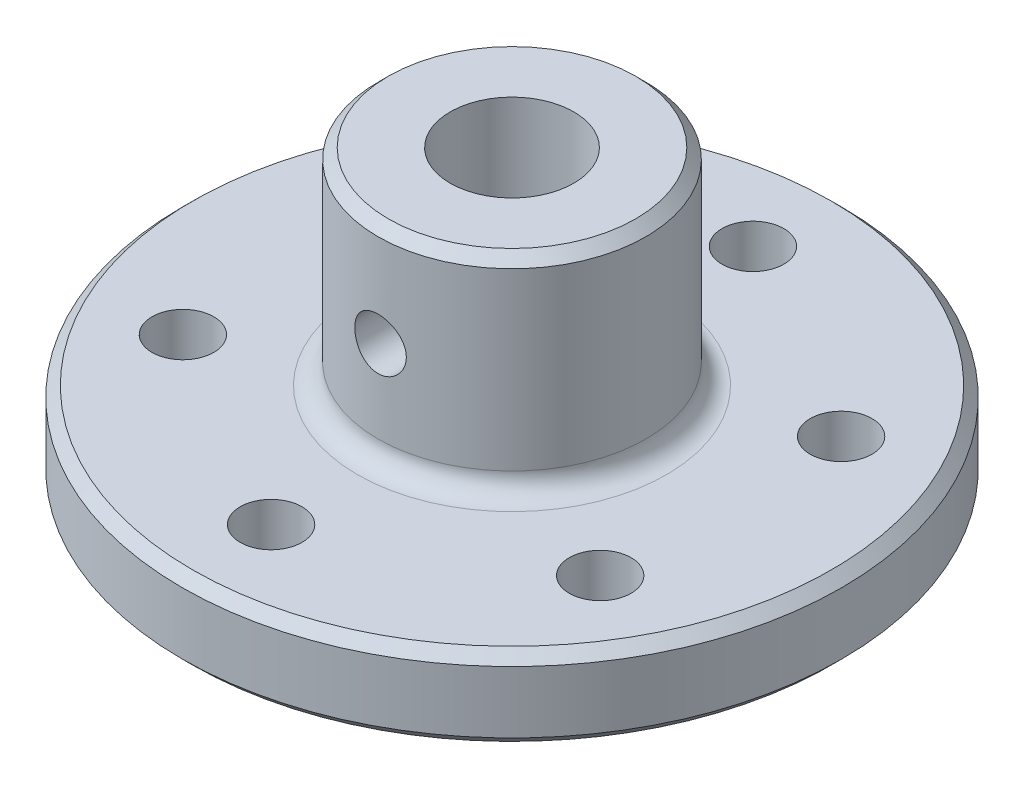
ISO-10303-21;
HEADER;
FILE_DESCRIPTION(('STEP AP214'),'2;1');
FILE_NAME('part.step','',(''),(''),'','','');
FILE_SCHEMA(('AUTOMOTIVE_DESIGN { 1 0 10303 214 1 1 1 1 }'));
ENDSEC;
DATA;
#1=APPLICATION_CONTEXT('core data for automotive mechanical design processes');
#2=APPLICATION_PROTOCOL_DEFINITION('international standard','automotive_design',2000,#1);
#3=PRODUCT_CONTEXT('',#1,'mechanical');
#4=PRODUCT('Part','Part','',(#3));
#5=PRODUCT_RELATED_PRODUCT_CATEGORY('part','',(#4));
#6=PRODUCT_DEFINITION_FORMATION('','',#4);
#7=PRODUCT_DEFINITION_CONTEXT('part definition',#1,'design');
#8=PRODUCT_DEFINITION('design','',#6,#7);
#9=PRODUCT_DEFINITION_SHAPE('','',#8);
#10=(LENGTH_UNIT() NAMED_UNIT(*) SI_UNIT(.MILLI.,.METRE.));
#11=(NAMED_UNIT(*) PLANE_ANGLE_UNIT() SI_UNIT($,.RADIAN.));
#12=(NAMED_UNIT(*) SI_UNIT($,.STERADIAN.) SOLID_ANGLE_UNIT());
#13=UNCERTAINTY_MEASURE_WITH_UNIT(LENGTH_MEASURE(1.E-05),#10,'distance_accuracy_value','');
#14=(GEOMETRIC_REPRESENTATION_CONTEXT(3) GLOBAL_UNCERTAINTY_ASSIGNED_CONTEXT((#13)) GLOBAL_UNIT_ASSIGNED_CONTEXT((#10,
#11,#12)) REPRESENTATION_CONTEXT('',''));
#15=CARTESIAN_POINT('',(0.,0.,0.));
#16=DIRECTION('',(0.,0.,1.));
#17=DIRECTION('',(1.,0.,0.));
#18=AXIS2_PLACEMENT_3D('',#15,#16,#17);
#19=CARTESIAN_POINT('',(0.,4.,0.));
#20=DIRECTION('',(0.,1.,0.));
#21=DIRECTION('',(0.,0.,1.));
#22=AXIS2_PLACEMENT_3D('',#19,#20,#21);
#23=PLANE('',#22);
#24=CARTESIAN_POINT('',(0.,4.,0.));
#25=DIRECTION('',(0.,1.,0.));
#26=DIRECTION('',(0.,0.,1.));
#27=AXIS2_PLACEMENT_3D('',#24,#25,#26);
#28=CIRCLE('',#27,15.5);
#29=CARTESIAN_POINT('',(0.,4.,15.5));
#30=VERTEX_POINT('',#29);
#31=EDGE_CURVE('E44',#30,#30,#28,.T.);
#32=ORIENTED_EDGE('',*,*,#31,.T.);
#33=EDGE_LOOP('',(#32));
#34=FACE_BOUND('',#33,.T.);
#35=CARTESIAN_POINT('',(0.,4.,0.));
#36=DIRECTION('',(0.,1.,0.));
#37=DIRECTION('',(0.,0.,1.));
#38=AXIS2_PLACEMENT_3D('',#35,#36,#37);
#39=CIRCLE('',#38,7.5);
#40=CARTESIAN_POINT('',(0.,4.,7.5));
#41=VERTEX_POINT('',#40);
#42=EDGE_CURVE('E59',#41,#41,#39,.F.);
#43=ORIENTED_EDGE('',*,*,#42,.T.);
#44=EDGE_LOOP('',(#43));
#45=FACE_BOUND('',#44,.T.);
#46=CARTESIAN_POINT('',(-10.125,4.,5.84567147554497));
#47=DIRECTION('',(0.,1.,0.));
#48=DIRECTION('',(0.,0.,1.));
#49=AXIS2_PLACEMENT_3D('',#46,#47,#48);
#50=CIRCLE('',#49,1.5);
#51=CARTESIAN_POINT('',(-10.125,4.,7.34567147554497));
#52=VERTEX_POINT('',#51);
#53=EDGE_CURVE('E169',#52,#52,#50,.T.);
#54=ORIENTED_EDGE('',*,*,#53,.F.);
#55=EDGE_LOOP('',(#54));
#56=FACE_BOUND('',#55,.T.);
#57=CARTESIAN_POINT('',(10.125,4.,5.84567147554496));
#58=DIRECTION('',(0.,1.,0.));
#59=DIRECTION('',(0.,0.,1.));
#60=AXIS2_PLACEMENT_3D('',#57,#58,#59);
#61=CIRCLE('',#60,1.49999999999997);
#62=CARTESIAN_POINT('',(10.125,4.,7.34567147554494));
#63=VERTEX_POINT('',#62);
#64=EDGE_CURVE('E173',#63,#63,#61,.T.);
#65=ORIENTED_EDGE('',*,*,#64,.F.);
#66=EDGE_LOOP('',(#65));
#67=FACE_BOUND('',#66,.T.);
#68=CARTESIAN_POINT('',(0.,4.,-11.6913429510899));
#69=DIRECTION('',(0.,1.,0.));
#70=DIRECTION('',(0.,0.,1.));
#71=AXIS2_PLACEMENT_3D('',#68,#69,#70);
#72=CIRCLE('',#71,1.5);
#73=CARTESIAN_POINT('',(0.,4.,-10.1913429510899));
#74=VERTEX_POINT('',#73);
#75=EDGE_CURVE('E177',#74,#74,#72,.T.);
#76=ORIENTED_EDGE('',*,*,#75,.F.);
#77=EDGE_LOOP('',(#76));
#78=FACE_BOUND('',#77,.T.);
#79=CARTESIAN_POINT('',(10.125,4.,-5.84567147554497));
#80=DIRECTION('',(0.,1.,0.));
#81=DIRECTION('',(0.,0.,1.));
#82=AXIS2_PLACEMENT_3D('',#79,#80,#81);
#83=CIRCLE('',#82,1.5);
#84=CARTESIAN_POINT('',(10.125,4.,-4.34567147554497));
#85=VERTEX_POINT('',#84);
#86=EDGE_CURVE('E181',#85,#85,#83,.T.);
#87=ORIENTED_EDGE('',*,*,#86,.F.);
#88=EDGE_LOOP('',(#87));
#89=FACE_BOUND('',#88,.T.);
#90=CARTESIAN_POINT('',(0.,4.,11.6913429510899));
#91=DIRECTION('',(0.,1.,0.));
#92=DIRECTION('',(0.,0.,1.));
#93=AXIS2_PLACEMENT_3D('',#90,#91,#92);
#94=CIRCLE('',#93,1.5);
#95=CARTESIAN_POINT('',(0.,4.,13.1913429510899));
#96=VERTEX_POINT('',#95);
#97=EDGE_CURVE('E185',#96,#96,#94,.T.);
#98=ORIENTED_EDGE('',*,*,#97,.F.);
#99=EDGE_LOOP('',(#98));
#100=FACE_BOUND('',#99,.T.);
#101=CARTESIAN_POINT('',(-10.125,4.,-5.84567147554496));
#102=DIRECTION('',(0.,1.,0.));
#103=DIRECTION('',(0.,0.,1.));
#104=AXIS2_PLACEMENT_3D('',#101,#102,#103);
#105=CIRCLE('',#104,1.5);
#106=CARTESIAN_POINT('',(-10.125,4.,-4.34567147554496));
#107=VERTEX_POINT('',#106);
#108=EDGE_CURVE('E188',#107,#107,#105,.T.);
#109=ORIENTED_EDGE('',*,*,#108,.F.);
#110=EDGE_LOOP('',(#109));
#111=FACE_BOUND('',#110,.T.);
#112=ADVANCED_FACE('F32',(#34,#45,#56,#67,#78,#89,#100,#111),#23,.T.);
#113=CARTESIAN_POINT('',(0.,0.,0.));
#114=DIRECTION('',(0.,1.,0.));
#115=DIRECTION('',(0.,0.,1.));
#116=AXIS2_PLACEMENT_3D('',#113,#114,#115);
#117=PLANE('',#116);
#118=CARTESIAN_POINT('',(0.,0.,0.));
#119=DIRECTION('',(0.,1.,0.));
#120=DIRECTION('',(0.,0.,1.));
#121=AXIS2_PLACEMENT_3D('',#118,#119,#120);
#122=CIRCLE('',#121,15.5);
#123=CARTESIAN_POINT('',(0.,0.,15.5));
#124=VERTEX_POINT('',#123);
#125=EDGE_CURVE('E48',#124,#124,#122,.F.);
#126=ORIENTED_EDGE('',*,*,#125,.T.);
#127=EDGE_LOOP('',(#126));
#128=FACE_BOUND('',#127,.T.);
#129=CARTESIAN_POINT('',(0.,0.,-11.6913429510899));
#130=DIRECTION('',(0.,1.,0.));
#131=DIRECTION('',(0.,0.,1.));
#132=AXIS2_PLACEMENT_3D('',#129,#130,#131);
#133=CIRCLE('',#132,1.5);
#134=CARTESIAN_POINT('',(0.,0.,-10.1913429510899));
#135=VERTEX_POINT('',#134);
#136=EDGE_CURVE('E210',#135,#135,#133,.T.);
#137=ORIENTED_EDGE('',*,*,#136,.T.);
#138=EDGE_LOOP('',(#137));
#139=FACE_BOUND('',#138,.T.);
#140=CARTESIAN_POINT('',(10.125,0.,-5.84567147554497));
#141=DIRECTION('',(0.,1.,0.));
#142=DIRECTION('',(0.,0.,1.));
#143=AXIS2_PLACEMENT_3D('',#140,#141,#142);
#144=CIRCLE('',#143,1.5);
#145=CARTESIAN_POINT('',(10.125,0.,-4.34567147554497));
#146=VERTEX_POINT('',#145);
#147=EDGE_CURVE('E206',#146,#146,#144,.T.);
#148=ORIENTED_EDGE('',*,*,#147,.T.);
#149=EDGE_LOOP('',(#148));
#150=FACE_BOUND('',#149,.T.);
#151=CARTESIAN_POINT('',(10.125,0.,5.84567147554496));
#152=DIRECTION('',(0.,1.,0.));
#153=DIRECTION('',(0.,0.,1.));
#154=AXIS2_PLACEMENT_3D('',#151,#152,#153);
#155=CIRCLE('',#154,1.49999999999997);
#156=CARTESIAN_POINT('',(10.125,0.,7.34567147554494));
#157=VERTEX_POINT('',#156);
#158=EDGE_CURVE('E202',#157,#157,#155,.T.);
#159=ORIENTED_EDGE('',*,*,#158,.T.);
#160=EDGE_LOOP('',(#159));
#161=FACE_BOUND('',#160,.T.);
#162=CARTESIAN_POINT('',(0.,0.,11.6913429510899));
#163=DIRECTION('',(0.,1.,0.));
#164=DIRECTION('',(0.,0.,1.));
#165=AXIS2_PLACEMENT_3D('',#162,#163,#164);
#166=CIRCLE('',#165,1.5);
#167=CARTESIAN_POINT('',(0.,0.,13.1913429510899));
#168=VERTEX_POINT('',#167);
#169=EDGE_CURVE('E199',#168,#168,#166,.T.);
#170=ORIENTED_EDGE('',*,*,#169,.T.);
#171=EDGE_LOOP('',(#170));
#172=FACE_BOUND('',#171,.T.);
#173=CARTESIAN_POINT('',(-10.125,0.,5.84567147554497));
#174=DIRECTION('',(0.,1.,0.));
#175=DIRECTION('',(0.,0.,1.));
#176=AXIS2_PLACEMENT_3D('',#173,#174,#175);
#177=CIRCLE('',#176,1.5);
#178=CARTESIAN_POINT('',(-10.125,0.,7.34567147554497));
#179=VERTEX_POINT('',#178);
#180=EDGE_CURVE('E189',#179,#179,#177,.T.);
#181=ORIENTED_EDGE('',*,*,#180,.T.);
#182=EDGE_LOOP('',(#181));
#183=FACE_BOUND('',#182,.T.);
#184=CARTESIAN_POINT('',(-10.125,0.,-5.84567147554496));
#185=DIRECTION('',(0.,1.,0.));
#186=DIRECTION('',(0.,0.,1.));
#187=AXIS2_PLACEMENT_3D('',#184,#185,#186);
#188=CIRCLE('',#187,1.5);
#189=CARTESIAN_POINT('',(-10.125,0.,-4.34567147554496));
#190=VERTEX_POINT('',#189);
#191=EDGE_CURVE('E190',#190,#190,#188,.T.);
#192=ORIENTED_EDGE('',*,*,#191,.T.);
#193=EDGE_LOOP('',(#192));
#194=FACE_BOUND('',#193,.T.);
#195=CARTESIAN_POINT('',(0.,0.,0.));
#196=DIRECTION('',(0.,1.,0.));
#197=DIRECTION('',(0.,0.,1.));
#198=AXIS2_PLACEMENT_3D('',#195,#196,#197);
#199=CIRCLE('',#198,3.);
#200=CARTESIAN_POINT('',(0.,0.,3.));
#201=VERTEX_POINT('',#200);
#202=EDGE_CURVE('E195',#201,#201,#199,.T.);
#203=ORIENTED_EDGE('',*,*,#202,.T.);
#204=EDGE_LOOP('',(#203));
#205=FACE_BOUND('',#204,.T.);
#206=ADVANCED_FACE('F132',(#128,#139,#150,#161,#172,#183,#194,#205),#117,.F.);
#207=CARTESIAN_POINT('',(0.,4.,0.));
#208=DIRECTION('',(0.,-1.,0.));
#209=DIRECTION('',(0.,0.,-1.));
#210=AXIS2_PLACEMENT_3D('',#207,#208,#209);
#211=CYLINDRICAL_SURFACE('',#210,16.);
#212=CARTESIAN_POINT('',(0.,0.5,0.));
#213=DIRECTION('',(0.,1.,0.));
#214=DIRECTION('',(0.,0.,1.));
#215=AXIS2_PLACEMENT_3D('',#212,#213,#214);
#216=CIRCLE('',#215,16.);
#217=CARTESIAN_POINT('',(0.,0.5,16.));
#218=VERTEX_POINT('',#217);
#219=EDGE_CURVE('E53',#218,#218,#216,.T.);
#220=ORIENTED_EDGE('',*,*,#219,.T.);
#221=EDGE_LOOP('',(#220));
#222=FACE_BOUND('',#221,.T.);
#223=CARTESIAN_POINT('',(0.,3.5,0.));
#224=DIRECTION('',(0.,1.,0.));
#225=DIRECTION('',(0.,0.,1.));
#226=AXIS2_PLACEMENT_3D('',#223,#224,#225);
#227=CIRCLE('',#226,16.);
#228=CARTESIAN_POINT('',(0.,3.5,16.));
#229=VERTEX_POINT('',#228);
#230=EDGE_CURVE('E56',#229,#229,#227,.F.);
#231=ORIENTED_EDGE('',*,*,#230,.T.);
#232=EDGE_LOOP('',(#231));
#233=FACE_BOUND('',#232,.T.);
#234=ADVANCED_FACE('F128',(#222,#233),#211,.T.);
#235=CARTESIAN_POINT('',(0.,4.,-11.6913429510899));
#236=DIRECTION('',(0.,-1.,0.));
#237=DIRECTION('',(0.,0.,-1.));
#238=AXIS2_PLACEMENT_3D('',#235,#236,#237);
#239=CYLINDRICAL_SURFACE('',#238,1.5);
#240=ORIENTED_EDGE('',*,*,#75,.T.);
#241=EDGE_LOOP('',(#240));
#242=FACE_BOUND('',#241,.T.);
#243=ORIENTED_EDGE('',*,*,#136,.F.);
#244=EDGE_LOOP('',(#243));
#245=FACE_BOUND('',#244,.T.);
#246=ADVANCED_FACE('F124',(#242,#245),#239,.F.);
#247=CARTESIAN_POINT('',(10.125,4.,-5.84567147554497));
#248=DIRECTION('',(0.,-1.,0.));
#249=DIRECTION('',(0.,0.,-1.));
#250=AXIS2_PLACEMENT_3D('',#247,#248,#249);
#251=CYLINDRICAL_SURFACE('',#250,1.5);
#252=ORIENTED_EDGE('',*,*,#86,.T.);
#253=EDGE_LOOP('',(#252));
#254=FACE_BOUND('',#253,.T.);
#255=ORIENTED_EDGE('',*,*,#147,.F.);
#256=EDGE_LOOP('',(#255));
#257=FACE_BOUND('',#256,.T.);
#258=ADVANCED_FACE('F120',(#254,#257),#251,.F.);
#259=CARTESIAN_POINT('',(10.125,4.,5.84567147554496));
#260=DIRECTION('',(0.,-1.,0.));
#261=DIRECTION('',(0.,0.,-1.));
#262=AXIS2_PLACEMENT_3D('',#259,#260,#261);
#263=CYLINDRICAL_SURFACE('',#262,1.49999999999997);
#264=ORIENTED_EDGE('',*,*,#64,.T.);
#265=EDGE_LOOP('',(#264));
#266=FACE_BOUND('',#265,.T.);
#267=ORIENTED_EDGE('',*,*,#158,.F.);
#268=EDGE_LOOP('',(#267));
#269=FACE_BOUND('',#268,.T.);
#270=ADVANCED_FACE('F116',(#266,#269),#263,.F.);
#271=CARTESIAN_POINT('',(0.,4.,11.6913429510899));
#272=DIRECTION('',(0.,-1.,0.));
#273=DIRECTION('',(0.,0.,-1.));
#274=AXIS2_PLACEMENT_3D('',#271,#272,#273);
#275=CYLINDRICAL_SURFACE('',#274,1.5);
#276=ORIENTED_EDGE('',*,*,#97,.T.);
#277=EDGE_LOOP('',(#276));
#278=FACE_BOUND('',#277,.T.);
#279=ORIENTED_EDGE('',*,*,#169,.F.);
#280=EDGE_LOOP('',(#279));
#281=FACE_BOUND('',#280,.T.);
#282=ADVANCED_FACE('F112',(#278,#281),#275,.F.);
#283=CARTESIAN_POINT('',(-10.125,4.,5.84567147554497));
#284=DIRECTION('',(0.,-1.,0.));
#285=DIRECTION('',(0.,0.,-1.));
#286=AXIS2_PLACEMENT_3D('',#283,#284,#285);
#287=CYLINDRICAL_SURFACE('',#286,1.5);
#288=ORIENTED_EDGE('',*,*,#53,.T.);
#289=EDGE_LOOP('',(#288));
#290=FACE_BOUND('',#289,.T.);
#291=ORIENTED_EDGE('',*,*,#180,.F.);
#292=EDGE_LOOP('',(#291));
#293=FACE_BOUND('',#292,.T.);
#294=ADVANCED_FACE('F108',(#290,#293),#287,.F.);
#295=CARTESIAN_POINT('',(-10.125,4.,-5.84567147554496));
#296=DIRECTION('',(0.,-1.,0.));
#297=DIRECTION('',(0.,0.,-1.));
#298=AXIS2_PLACEMENT_3D('',#295,#296,#297);
#299=CYLINDRICAL_SURFACE('',#298,1.5);
#300=ORIENTED_EDGE('',*,*,#108,.T.);
#301=EDGE_LOOP('',(#300));
#302=FACE_BOUND('',#301,.T.);
#303=ORIENTED_EDGE('',*,*,#191,.F.);
#304=EDGE_LOOP('',(#303));
#305=FACE_BOUND('',#304,.T.);
#306=ADVANCED_FACE('F103',(#302,#305),#299,.F.);
#307=CARTESIAN_POINT('',(0.,4.,0.));
#308=DIRECTION('',(0.,-1.,0.));
#309=DIRECTION('',(0.,0.,-1.));
#310=AXIS2_PLACEMENT_3D('',#307,#308,#309);
#311=CYLINDRICAL_SURFACE('',#310,3.);
#312=CARTESIAN_POINT('',(0.,10.25,-3.));
#313=CARTESIAN_POINT('',(-0.066958052636267,10.2499927949087,-2.99999458367273));
#314=CARTESIAN_POINT('',(-0.134021397063841,10.2445880414719,-2.9977323297471));
#315=CARTESIAN_POINT('',(-0.266247371156347,10.2231609350798,-2.98890153579552));
#316=CARTESIAN_POINT('',(-0.331404576423565,10.2071108755358,-2.98232175901028));
#317=CARTESIAN_POINT('',(-0.457688733653088,10.1650889082194,-2.96556289038127));
#318=CARTESIAN_POINT('',(-0.518828524426269,10.1391506105319,-2.95539599975004));
#319=CARTESIAN_POINT('',(-0.635829756679802,10.0782271767674,-2.93245286470664));
#320=CARTESIAN_POINT('',(-0.691692790015939,10.0432447810291,-2.91967741092849));
#321=CARTESIAN_POINT('',(-0.799448403559512,9.96337101740912,-2.89207828351869));
#322=CARTESIAN_POINT('',(-0.851041267517768,9.91809869121025,-2.87718753326093));
#323=CARTESIAN_POINT('',(-0.946159821091262,9.81973566521743,-2.84732714068514));
#324=CARTESIAN_POINT('',(-0.989681263153085,9.7666408751055,-2.83235746106809));
#325=CARTESIAN_POINT('',(-1.06953737697066,9.65097322243511,-2.80321021812995));
#326=CARTESIAN_POINT('',(-1.10541308153925,9.58806255157346,-2.78910786873385));
#327=CARTESIAN_POINT('',(-1.16593940588866,9.45642674207907,-2.76435572357005));
#328=CARTESIAN_POINT('',(-1.19059580836291,9.38770462051555,-2.75370415000823));
#329=CARTESIAN_POINT('',(-1.22674598312159,9.24984630823208,-2.73778555387705));
#330=CARTESIAN_POINT('',(-1.23881657877606,9.18088951660785,-2.73228387651787));
#331=CARTESIAN_POINT('',(-1.25125209967796,9.04172670731343,-2.72661326219504));
#332=CARTESIAN_POINT('',(-1.25162348054397,8.97152139997426,-2.7264413842526));
#333=CARTESIAN_POINT('',(-1.24108450363674,8.83759993956506,-2.73125119560853));
#334=CARTESIAN_POINT('',(-1.23103681112301,8.77379890343554,-2.73583882723623));
#335=CARTESIAN_POINT('',(-1.20139191015777,8.64888790899961,-2.74898482773796));
#336=CARTESIAN_POINT('',(-1.18179287287177,8.58777846850823,-2.75754395703564));
#337=CARTESIAN_POINT('',(-1.13321958727571,8.46844229700856,-2.77786184772756));
#338=CARTESIAN_POINT('',(-1.10405471539236,8.41030457908662,-2.78968481949136));
#339=CARTESIAN_POINT('',(-1.03731242580562,8.29952226611985,-2.81518331141086));
#340=CARTESIAN_POINT('',(-0.999731690519545,8.24687984938648,-2.82885956129779));
#341=CARTESIAN_POINT('',(-0.913495965543835,8.14390004126716,-2.85792976877979));
#342=CARTESIAN_POINT('',(-0.864173483207526,8.09413343261456,-2.87337121404473));
#343=CARTESIAN_POINT('',(-0.757729591051512,8.00338649704082,-2.90325673112529));
#344=CARTESIAN_POINT('',(-0.700606359448457,7.96240822830782,-2.9177005687701));
#345=CARTESIAN_POINT('',(-0.578447948693377,7.88956417638373,-2.94438283556473));
#346=CARTESIAN_POINT('',(-0.513260582447681,7.85793055484932,-2.95656266543334));
#347=CARTESIAN_POINT('',(-0.377852402526833,7.80627886039674,-2.97689481414803));
#348=CARTESIAN_POINT('',(-0.307634394795036,7.78625436805619,-2.985049358458));
#349=CARTESIAN_POINT('',(-0.168928113346229,7.75958400787336,-2.99599641186385));
#350=CARTESIAN_POINT('',(-0.10061128527864,7.75217214255625,-2.99909541047125));
#351=CARTESIAN_POINT('',(0.036354655496088,7.74865377638591,-3.00056050368745));
#352=CARTESIAN_POINT('',(0.105003667152635,7.752544029748,-2.99892795711939));
#353=CARTESIAN_POINT('',(0.237098242341434,7.77097108480607,-2.9913121765694));
#354=CARTESIAN_POINT('',(0.300632966639385,7.7849699540972,-2.9855488728399));
#355=CARTESIAN_POINT('',(0.42438274897109,7.82246819454078,-2.97048606772414));
#356=CARTESIAN_POINT('',(0.48459738651836,7.8459687659503,-2.96118611959704));
#357=CARTESIAN_POINT('',(0.602108999869136,7.90257097571212,-2.93958270645166));
#358=CARTESIAN_POINT('',(0.659257236855323,7.93594818314603,-2.92719491469281));
#359=CARTESIAN_POINT('',(0.767346216231429,8.0110533777917,-2.9007380457909));
#360=CARTESIAN_POINT('',(0.818284352601941,8.05278485152927,-2.88666826768733));
#361=CARTESIAN_POINT('',(0.916333430274264,8.14690323327241,-2.85712087895438));
#362=CARTESIAN_POINT('',(0.962910697979836,8.19983850298626,-2.84161451591029));
#363=CARTESIAN_POINT('',(1.04666984610551,8.31302127593539,-2.81184336768005));
#364=CARTESIAN_POINT('',(1.08384959285617,8.37327043517173,-2.79757886493438));
#365=CARTESIAN_POINT('',(1.14815960208699,8.50061417530258,-2.77181386243988));
#366=CARTESIAN_POINT('',(1.17513918237329,8.56779403551483,-2.76035562555112));
#367=CARTESIAN_POINT('',(1.21717413951573,8.70637059381011,-2.74208355658957));
#368=CARTESIAN_POINT('',(1.23223934863688,8.77776376248335,-2.73526589555752));
#369=CARTESIAN_POINT('',(1.24904080348901,8.91681869919921,-2.72763164537264));
#370=CARTESIAN_POINT('',(1.25171380413129,8.98434466229262,-2.72639350967163));
#371=CARTESIAN_POINT('',(1.24615575523912,9.1188428611411,-2.72893853011024));
#372=CARTESIAN_POINT('',(1.23792637964722,9.18581518031369,-2.73272091540306));
#373=CARTESIAN_POINT('',(1.21158404780491,9.31409274746889,-2.74449551302268));
#374=CARTESIAN_POINT('',(1.19394903571466,9.37551667346339,-2.7522835484648));
#375=CARTESIAN_POINT('',(1.14976328202135,9.49454802135723,-2.77103181199189));
#376=CARTESIAN_POINT('',(1.12321003517252,9.55215436539878,-2.78199293131693));
#377=CARTESIAN_POINT('',(1.0601028593549,9.66569589594912,-2.80666954560013));
#378=CARTESIAN_POINT('',(1.02304360910483,9.72132233016829,-2.82051102713679));
#379=CARTESIAN_POINT('',(0.940684072630392,9.82586013936068,-2.84903689053839));
#380=CARTESIAN_POINT('',(0.89538092890562,9.87476917560057,-2.86372156345875));
#381=CARTESIAN_POINT('',(0.793902045778822,9.96814868168475,-2.89356392850106));
#382=CARTESIAN_POINT('',(0.737174739949029,10.0120364328407,-2.90867817511792));
#383=CARTESIAN_POINT('',(0.616600079253201,10.0896994535436,-2.9366014362202));
#384=CARTESIAN_POINT('',(0.552749497945748,10.1234701148896,-2.9494093991674));
#385=CARTESIAN_POINT('',(0.420732056717952,10.1792098454399,-2.97109183362461));
#386=CARTESIAN_POINT('',(0.352653990980637,10.2013647666173,-2.98002782581964));
#387=CARTESIAN_POINT('',(0.21341042184656,10.2337063290778,-2.99321009768625));
#388=CARTESIAN_POINT('',(0.142255316980958,10.2439304425299,-2.99747105811967));
#389=CARTESIAN_POINT('',(0.0472360819191838,10.2493331610864,-2.99972287568934));
#390=CARTESIAN_POINT('',(0.0236245946756573,10.2500025421492,-3.00000191102536));
#391=CARTESIAN_POINT('',(0.,10.25,-3.));
#392=B_SPLINE_CURVE_WITH_KNOTS('',3,(#312,#313,#314,#315,#316,#317,#318,#319,#320,#321,#322,
#323,#324,#325,#326,#327,#328,#329,#330,#331,#332,#333,#334,#335,#336,#337,#338,#339,#340,#341,
#342,#343,#344,#345,#346,#347,#348,#349,#350,#351,#352,#353,#354,#355,#356,#357,#358,#359,#360,
#361,#362,#363,#364,#365,#366,#367,#368,#369,#370,#371,#372,#373,#374,#375,#376,#377,#378,#379,
#380,#381,#382,#383,#384,#385,#386,#387,#388,#389,#390,#391),.UNSPECIFIED.,.T.,.F.,(4,2,2,2,2,2,
2,2,2,2,2,2,2,2,2,2,2,2,2,2,2,2,2,2,2,2,2,2,2,2,2,2,2,2,2,2,2,2,2,4),(0.,0.200806918883939,
0.402138540628696,0.602791851906301,0.803384436852974,1.01317936288807,1.22308438131465,
1.44331724539125,1.66343646730588,1.87295273137557,2.08235338249046,2.27570157202557,
2.46908679727213,2.66658713058714,2.86416545717207,3.07844141127897,3.29276749314588,
3.51204055060813,3.73119224218297,3.93648443393251,4.14171767493172,4.33676589735722,
4.53183876601785,4.73297135272161,4.93418805469496,5.14978488029295,5.36543061240342,
5.58414788359524,5.80268447074581,6.00439877559644,6.20608211297537,6.39837649964763,
6.59072494950613,6.79463893397442,6.99862373425944,7.21746535004889,7.43640649428583,
7.65172855819386,7.86637250469322,7.93722256499098),.UNSPECIFIED.);
#393=CARTESIAN_POINT('',(0.,10.25,-3.));
#394=VERTEX_POINT('',#393);
#395=EDGE_CURVE('E94',#394,#394,#392,.T.);
#396=ORIENTED_EDGE('',*,*,#395,.F.);
#397=EDGE_LOOP('',(#396));
#398=FACE_BOUND('',#397,.T.);
#399=CARTESIAN_POINT('',(1.25,9.,2.72717802865893));
#400=CARTESIAN_POINT('',(1.24999259066568,8.93332810910315,2.72718519563219));
#401=CARTESIAN_POINT('',(1.24463203881503,8.86654734317379,2.729658595344));
#402=CARTESIAN_POINT('',(1.22339678947785,8.73491305794286,2.73923833650884));
#403=CARTESIAN_POINT('',(1.20749354003276,8.67006527332476,2.74635725824267));
#404=CARTESIAN_POINT('',(1.16589988419451,8.54443887030893,2.76426917574768));
#405=CARTESIAN_POINT('',(1.14024937431428,8.48364483628498,2.77504717562616));
#406=CARTESIAN_POINT('',(1.08000637754463,8.36724055042195,2.79904148565793));
#407=CARTESIAN_POINT('',(1.04541600591531,8.31162907656688,2.81225721880783));
#408=CARTESIAN_POINT('',(0.965973882676167,8.20367427502653,2.84055762619857));
#409=CARTESIAN_POINT('',(0.920653238184409,8.15169244125591,2.85570568079146));
#410=CARTESIAN_POINT('',(0.822021675745551,8.05579977750245,2.88564295372227));
#411=CARTESIAN_POINT('',(0.768707691374006,8.01189205938699,2.90043203180789));
#412=CARTESIAN_POINT('',(0.652763393797349,7.93155046912072,2.92875537930613));
#413=CARTESIAN_POINT('',(0.58982929368366,7.89552337196765,2.94220739975291));
#414=CARTESIAN_POINT('',(0.458132022362354,7.8347239794944,2.96556519993426));
#415=CARTESIAN_POINT('',(0.389371454872125,7.80994668803578,2.97547255347157));
#416=CARTESIAN_POINT('',(0.251768498025166,7.77366054124326,2.99017521042367));
#417=CARTESIAN_POINT('',(0.183116576196081,7.76152830509795,2.99520971127466));
#418=CARTESIAN_POINT('',(0.0445791803650065,7.74886235884014,3.00046828611204));
#419=CARTESIAN_POINT('',(-0.025305781764516,7.74832394411704,3.00069431131015));
#420=CARTESIAN_POINT('',(-0.159792780112568,7.75853428093332,2.99645129133057));
#421=CARTESIAN_POINT('',(-0.224457488607313,7.76859810052573,2.99226714648664));
#422=CARTESIAN_POINT('',(-0.351082893931456,7.79855310263816,2.98006516750309));
#423=CARTESIAN_POINT('',(-0.413043391054916,7.81844500963016,2.97204705074577));
#424=CARTESIAN_POINT('',(-0.533638118077525,7.86772804089464,2.95279852414029));
#425=CARTESIAN_POINT('',(-0.592207177074906,7.89725946287083,2.94152097126085));
#426=CARTESIAN_POINT('',(-0.703711767281963,7.96484575670034,2.91685713989805));
#427=CARTESIAN_POINT('',(-0.756645297756974,8.00290364084499,2.90347011666255));
#428=CARTESIAN_POINT('',(-0.859340911707924,8.08958242040462,2.87481698777061));
#429=CARTESIAN_POINT('',(-0.90861643731624,8.13875879127901,2.8594849435601));
#430=CARTESIAN_POINT('',(-0.998431414927667,8.24471144070658,2.8293786068147));
#431=CARTESIAN_POINT('',(-1.03896749582431,8.30149063829209,2.8146045313137));
#432=CARTESIAN_POINT('',(-1.11140189250063,8.42339503666191,2.78681612355338));
#433=CARTESIAN_POINT('',(-1.1429725335554,8.48873320574328,2.77387558556714));
#434=CARTESIAN_POINT('',(-1.19446432058392,8.6244810449745,2.75209844221011));
#435=CARTESIAN_POINT('',(-1.21439379627313,8.69488704826954,2.74325890334594));
#436=CARTESIAN_POINT('',(-1.24080025168121,8.833896808914,2.73141212519724));
#437=CARTESIAN_POINT('',(-1.24806614632866,8.90232112225905,2.72806369197117));
#438=CARTESIAN_POINT('',(-1.25125630518999,9.0394784824115,2.72660286810642));
#439=CARTESIAN_POINT('',(-1.24718449318149,9.10821141419171,2.72848866599319));
#440=CARTESIAN_POINT('',(-1.22853477565556,9.23939838543045,2.73693131345749));
#441=CARTESIAN_POINT('',(-1.21464618818048,9.3019726867868,2.74318138016618));
#442=CARTESIAN_POINT('',(-1.17767058564225,9.42385129649787,2.75925630297447));
#443=CARTESIAN_POINT('',(-1.15458142053125,9.48315483683071,2.76908199460161));
#444=CARTESIAN_POINT('',(-1.09877520805187,9.59961531035647,2.79170797857));
#445=CARTESIAN_POINT('',(-1.06569183306198,9.65657497461032,2.80461662202282));
#446=CARTESIAN_POINT('',(-0.991200784385972,9.76440805249902,2.83180003740794));
#447=CARTESIAN_POINT('',(-0.949789507875989,9.81527881670187,2.84607539920583));
#448=CARTESIAN_POINT('',(-0.855844455715506,9.913800134884,2.87578619784532));
#449=CARTESIAN_POINT('',(-0.802679661479739,9.96085139995066,2.89122146708842));
#450=CARTESIAN_POINT('',(-0.688851512553539,10.0454722919793,2.92043361183923));
#451=CARTESIAN_POINT('',(-0.628187608803657,10.0830412240637,2.93421036577013));
#452=CARTESIAN_POINT('',(-0.500654680803386,10.1475898754436,2.9586425158565));
#453=CARTESIAN_POINT('',(-0.433770169638508,10.1745422412895,2.96928983138826));
#454=CARTESIAN_POINT('',(-0.295858835154419,10.2166167923344,2.98618173103366));
#455=CARTESIAN_POINT('',(-0.224834504225197,10.2317460182261,2.9924289351992));
#456=CARTESIAN_POINT('',(-0.0860165335064127,10.2488581255203,2.9995153479751));
#457=CARTESIAN_POINT('',(-0.0183440847938993,10.251685999697,3.00070204534225));
#458=CARTESIAN_POINT('',(0.116486811714284,10.2463868587061,2.99849523480953));
#459=CARTESIAN_POINT('',(0.183645347541154,10.2382617639871,2.99510252984313));
#460=CARTESIAN_POINT('',(0.313086482449184,10.2118939278413,2.98430065981734));
#461=CARTESIAN_POINT('',(0.375457537843568,10.1940203195304,2.97703824209233));
#462=CARTESIAN_POINT('',(0.49629223050133,10.1490657527909,2.95929499847058));
#463=CARTESIAN_POINT('',(0.554755122985826,10.1219830453351,2.94881356124207));
#464=CARTESIAN_POINT('',(0.669024565478781,10.0580104707855,2.92505825398663));
#465=CARTESIAN_POINT('',(0.724591657976681,10.020732698576,2.91167959188766));
#466=CARTESIAN_POINT('',(0.828918675638781,9.93799281712811,2.88371561874231));
#467=CARTESIAN_POINT('',(0.877676061786042,9.89252766959325,2.86912986083797));
#468=CARTESIAN_POINT('',(0.97044978723158,9.7910551741456,2.83914845259141));
#469=CARTESIAN_POINT('',(1.01391775364847,9.73454098537888,2.82376522857896));
#470=CARTESIAN_POINT('',(1.09083332306674,9.61454125931981,2.79495552690186));
#471=CARTESIAN_POINT('',(1.12427532456755,9.55105185194186,2.78153014522558));
#472=CARTESIAN_POINT('',(1.17982766043577,9.41905616497725,2.75842557732642));
#473=CARTESIAN_POINT('',(1.20199823632854,9.35057884120679,2.74872654469865));
#474=CARTESIAN_POINT('',(1.23423556453801,9.21046042614933,2.73440803066667));
#475=CARTESIAN_POINT('',(1.2443429152121,9.1388307927257,2.72977151604981));
#476=CARTESIAN_POINT('',(1.2494046492365,9.04464147573811,2.72744979732688));
#477=CARTESIAN_POINT('',(1.25000248121118,9.02232684261197,2.72717562860874));
#478=CARTESIAN_POINT('',(1.25,9.,2.72717802865893));
#479=B_SPLINE_CURVE_WITH_KNOTS('',3,(#399,#400,#401,#402,#403,#404,#405,#406,#407,#408,#409,
#410,#411,#412,#413,#414,#415,#416,#417,#418,#419,#420,#421,#422,#423,#424,#425,#426,#427,#428,
#429,#430,#431,#432,#433,#434,#435,#436,#437,#438,#439,#440,#441,#442,#443,#444,#445,#446,#447,
#448,#449,#450,#451,#452,#453,#454,#455,#456,#457,#458,#459,#460,#461,#462,#463,#464,#465,#466,
#467,#468,#469,#470,#471,#472,#473,#474,#475,#476,#477,#478),.UNSPECIFIED.,.T.,.F.,(4,2,2,2,2,2,
2,2,2,2,2,2,2,2,2,2,2,2,2,2,2,2,2,2,2,2,2,2,2,2,2,2,2,2,2,2,2,2,2,4),(0.,0.199951711985515,
0.400447161842176,0.600130652152113,0.799766938550099,1.01066841430654,1.22165100459911,
1.44178476577924,1.66182066774891,1.87040605977952,2.0789068091793,2.27471840245093,
2.47054443201884,2.66935814640066,2.86824221022484,3.08114531844484,3.29413040441367,
3.51411545666722,3.73394290745569,3.93950778306307,4.14500152518449,4.33733901066192,
4.5297214691353,4.73025126818169,4.93086800795465,5.14781662735514,5.36478114041867,
5.58230105955595,5.79969134643008,6.00188635094054,6.20404590801915,6.39903415036488,
6.59405944632173,6.79789862829037,7.00181361048905,7.21960426908078,7.4375163813919,
7.65425125796866,7.87025464546163,7.93721375436706),.UNSPECIFIED.);
#480=CARTESIAN_POINT('',(1.25,9.,2.72717802865893));
#481=VERTEX_POINT('',#480);
#482=EDGE_CURVE('E68',#481,#481,#479,.T.);
#483=ORIENTED_EDGE('',*,*,#482,.F.);
#484=EDGE_LOOP('',(#483));
#485=FACE_BOUND('',#484,.T.);
#486=ORIENTED_EDGE('',*,*,#202,.F.);
#487=EDGE_LOOP('',(#486));
#488=FACE_BOUND('',#487,.T.);
#489=CARTESIAN_POINT('',(0.,14.,0.));
#490=DIRECTION('',(0.,1.,0.));
#491=DIRECTION('',(0.,0.,1.));
#492=AXIS2_PLACEMENT_3D('',#489,#490,#491);
#493=CIRCLE('',#492,3.);
#494=CARTESIAN_POINT('',(0.,14.,3.));
#495=VERTEX_POINT('',#494);
#496=EDGE_CURVE('E243',#495,#495,#493,.T.);
#497=ORIENTED_EDGE('',*,*,#496,.T.);
#498=EDGE_LOOP('',(#497));
#499=FACE_BOUND('',#498,.T.);
#500=ADVANCED_FACE('F99',(#398,#485,#488,#499),#311,.F.);
#501=CARTESIAN_POINT('',(0.,14.,0.));
#502=DIRECTION('',(0.,1.,0.));
#503=DIRECTION('',(0.,0.,1.));
#504=AXIS2_PLACEMENT_3D('',#501,#502,#503);
#505=PLANE('',#504);
#506=CARTESIAN_POINT('',(0.,14.,0.));
#507=DIRECTION('',(0.,1.,0.));
#508=DIRECTION('',(0.,0.,1.));
#509=AXIS2_PLACEMENT_3D('',#506,#507,#508);
#510=CIRCLE('',#509,6.);
#511=CARTESIAN_POINT('',(0.,14.,6.));
#512=VERTEX_POINT('',#511);
#513=EDGE_CURVE('E40',#512,#512,#510,.T.);
#514=ORIENTED_EDGE('',*,*,#513,.T.);
#515=EDGE_LOOP('',(#514));
#516=FACE_BOUND('',#515,.T.);
#517=ORIENTED_EDGE('',*,*,#496,.F.);
#518=EDGE_LOOP('',(#517));
#519=FACE_BOUND('',#518,.T.);
#520=ADVANCED_FACE('F84',(#516,#519),#505,.T.);
#521=CARTESIAN_POINT('',(0.,14.,0.));
#522=DIRECTION('',(0.,-1.,0.));
#523=DIRECTION('',(0.,0.,-1.));
#524=AXIS2_PLACEMENT_3D('',#521,#522,#523);
#525=CYLINDRICAL_SURFACE('',#524,6.5);
#526=CARTESIAN_POINT('',(0.,13.5,0.));
#527=DIRECTION('',(0.,1.,0.));
#528=DIRECTION('',(0.,0.,1.));
#529=AXIS2_PLACEMENT_3D('',#526,#527,#528);
#530=CIRCLE('',#529,6.5);
#531=CARTESIAN_POINT('',(0.,13.5,6.5));
#532=VERTEX_POINT('',#531);
#533=EDGE_CURVE('E10',#532,#532,#530,.F.);
#534=ORIENTED_EDGE('',*,*,#533,.T.);
#535=EDGE_LOOP('',(#534));
#536=FACE_BOUND('',#535,.T.);
#537=CARTESIAN_POINT('',(0.,10.25,-6.5));
#538=CARTESIAN_POINT('',(-0.0695263300903768,10.2499973793901,-6.49999873054918));
#539=CARTESIAN_POINT('',(-0.139086386536077,10.244179706351,-6.49887299034978));
#540=CARTESIAN_POINT('',(-0.27624406654568,10.2210790275689,-6.49449072478032));
#541=CARTESIAN_POINT('',(-0.343840022447299,10.203786559657,-6.49123244093525));
#542=CARTESIAN_POINT('',(-0.475066268731186,10.1582872097559,-6.48294932466697));
#543=CARTESIAN_POINT('',(-0.538700159856867,10.1300904108632,-6.47792612463065));
#544=CARTESIAN_POINT('',(-0.660328619211792,10.0636119360369,-6.46666077439192));
#545=CARTESIAN_POINT('',(-0.718323597744221,10.0253309946069,-6.46041871297687));
#546=CARTESIAN_POINT('',(-0.827762164871109,9.93926041714611,-6.44731615012176));
#547=CARTESIAN_POINT('',(-0.879124647683768,9.89136858427445,-6.44044947743084));
#548=CARTESIAN_POINT('',(-0.973138343078082,9.78765548140267,-6.42691706808667));
#549=CARTESIAN_POINT('',(-1.01578890972676,9.73183362396171,-6.42025134636388));
#550=CARTESIAN_POINT('',(-1.09150839810311,9.6132680023211,-6.4078154700976));
#551=CARTESIAN_POINT('',(-1.12449425725113,9.55047028444983,-6.40205326632547));
#552=CARTESIAN_POINT('',(-1.17941610157594,9.42009504498672,-6.39216406280365));
#553=CARTESIAN_POINT('',(-1.20135309167639,9.35251795872879,-6.38803691434868));
#554=CARTESIAN_POINT('',(-1.23329305228569,9.21537190414041,-6.38194735063818));
#555=CARTESIAN_POINT('',(-1.24343779395771,9.14583711665146,-6.37995924110286));
#556=CARTESIAN_POINT('',(-1.2519454509238,9.00602618154001,-6.37829543879725));
#557=CARTESIAN_POINT('',(-1.25030947843596,8.93575010452821,-6.3786195277321));
#558=CARTESIAN_POINT('',(-1.23541697804277,8.79748238841897,-6.38152012920898));
#559=CARTESIAN_POINT('',(-1.22232215325027,8.72947257761762,-6.38406529733108));
#560=CARTESIAN_POINT('',(-1.18513854067889,8.59663350844221,-6.39107200195107));
#561=CARTESIAN_POINT('',(-1.16104926380166,8.53180439170638,-6.39553362370363));
#562=CARTESIAN_POINT('',(-1.10240382729656,8.40669652809025,-6.40590301761788));
#563=CARTESIAN_POINT('',(-1.06778282798614,8.346448944746,-6.41181970353635));
#564=CARTESIAN_POINT('',(-0.989102525446738,8.23255751443072,-6.42442673553149));
#565=CARTESIAN_POINT('',(-0.945042216343233,8.17891437220416,-6.43111716402495));
#566=CARTESIAN_POINT('',(-0.847864455663339,8.07882073288959,-6.44465411904849));
#567=CARTESIAN_POINT('',(-0.794608805779966,8.0325044049816,-6.45150139326972));
#568=CARTESIAN_POINT('',(-0.681013328076994,7.94944224634974,-6.46447860514488));
#569=CARTESIAN_POINT('',(-0.620673422062239,7.91269652127943,-6.47060853487937));
#570=CARTESIAN_POINT('',(-0.494478881244397,7.84979697648017,-6.48147374305158));
#571=CARTESIAN_POINT('',(-0.428616856521534,7.82365763269142,-6.48620711303174));
#572=CARTESIAN_POINT('',(-0.293325284598558,7.78285128832655,-6.49373123608211));
#573=CARTESIAN_POINT('',(-0.223896137321169,7.7681830046674,-6.4965222064135));
#574=CARTESIAN_POINT('',(-0.0845949575723088,7.75092311692321,-6.4998170641524));
#575=CARTESIAN_POINT('',(-0.0147464889976599,7.74814776407948,-6.50035574677272));
#576=CARTESIAN_POINT('',(0.124416318296411,7.75425888859832,-6.49918164994221));
#577=CARTESIAN_POINT('',(0.193730684493375,7.76314476195117,-6.497468987103));
#578=CARTESIAN_POINT('',(0.329271121290111,7.79217337199752,-6.49200634359786));
#579=CARTESIAN_POINT('',(0.395517951862496,7.81222263921288,-6.48827328656802));
#580=CARTESIAN_POINT('',(0.523709778000947,7.86290739006222,-6.47918677244289));
#581=CARTESIAN_POINT('',(0.58565446945985,7.89354362114864,-6.47383320094063));
#582=CARTESIAN_POINT('',(0.704264341336228,7.96493587158737,-6.4620127326735));
#583=CARTESIAN_POINT('',(0.760861092631655,8.0058035457684,-6.4555338112679));
#584=CARTESIAN_POINT('',(0.866459302715515,8.09634811174868,-6.44221127589378));
#585=CARTESIAN_POINT('',(0.915460011904464,8.14602587191698,-6.43536762602225));
#586=CARTESIAN_POINT('',(1.00517755082431,8.25361408069802,-6.42197081919612));
#587=CARTESIAN_POINT('',(1.04576869619256,8.31163012514148,-6.41542307578637));
#588=CARTESIAN_POINT('',(1.11662974416659,8.43376516213667,-6.40347051879715));
#589=CARTESIAN_POINT('',(1.14690004216186,8.49788392077428,-6.39806566143698));
#590=CARTESIAN_POINT('',(1.19608442093859,8.63009317947312,-6.38905378658871));
#591=CARTESIAN_POINT('',(1.21505488797639,8.69816206673377,-6.385437857926));
#592=CARTESIAN_POINT('',(1.24127395271723,8.83659753660325,-6.38039343660705));
#593=CARTESIAN_POINT('',(1.24852394995944,8.9069638438537,-6.37896468278173));
#594=CARTESIAN_POINT('',(1.25104755843674,9.04673667796078,-6.37847010253234));
#595=CARTESIAN_POINT('',(1.24651955106104,9.11613956148371,-6.37936513521924));
#596=CARTESIAN_POINT('',(1.2260513326902,9.2531749722532,-6.38333023983079));
#597=CARTESIAN_POINT('',(1.21011119845593,9.32080751140438,-6.38640029712568));
#598=CARTESIAN_POINT('',(1.16735673858749,9.45226830992101,-6.39435266298136));
#599=CARTESIAN_POINT('',(1.14056497100194,9.51610414795882,-6.39923121033494));
#600=CARTESIAN_POINT('',(1.07688985392764,9.63840618094547,-6.4102533266987));
#601=CARTESIAN_POINT('',(1.04000574067459,9.69687196905446,-6.41639699144119));
#602=CARTESIAN_POINT('',(0.956507819072143,9.80776578734232,-6.42937795151368));
#603=CARTESIAN_POINT('',(0.909750049269228,9.86008434074107,-6.43622463982555));
#604=CARTESIAN_POINT('',(0.808131192425045,9.95619868774715,-6.44977101580728));
#605=CARTESIAN_POINT('',(0.753268246630376,9.99999252103404,-6.45647066935191));
#606=CARTESIAN_POINT('',(0.636368128673319,10.0782065084278,-6.46904328529454));
#607=CARTESIAN_POINT('',(0.574267467434711,10.1125331850346,-6.47490774506217));
#608=CARTESIAN_POINT('',(0.445086129675208,10.170210396182,-6.48506595383496));
#609=CARTESIAN_POINT('',(0.378010126647429,10.1935710839345,-6.48936115496814));
#610=CARTESIAN_POINT('',(0.258961782852773,10.2239922921073,-6.49503671875109));
#611=CARTESIAN_POINT('',(0.207678719850838,10.2337282448762,-6.49688729501668));
#612=CARTESIAN_POINT('',(0.104270079257342,10.2467329918185,-6.49936939476943));
#613=CARTESIAN_POINT('',(0.0521445250851635,10.250001965449,-6.50000095208405));
#614=CARTESIAN_POINT('',(0.,10.25,-6.5));
#615=B_SPLINE_CURVE_WITH_KNOTS('',3,(#537,#538,#539,#540,#541,#542,#543,#544,#545,#546,#547,
#548,#549,#550,#551,#552,#553,#554,#555,#556,#557,#558,#559,#560,#561,#562,#563,#564,#565,#566,
#567,#568,#569,#570,#571,#572,#573,#574,#575,#576,#577,#578,#579,#580,#581,#582,#583,#584,#585,
#586,#587,#588,#589,#590,#591,#592,#593,#594,#595,#596,#597,#598,#599,#600,#601,#602,#603,#604,
#605,#606,#607,#608,#609,#610,#611,#612,#613,#614),.UNSPECIFIED.,.T.,.F.,(4,2,2,2,2,2,2,2,2,2,2,
2,2,2,2,2,2,2,2,2,2,2,2,2,2,2,2,2,2,2,2,2,2,2,2,2,2,2,4),(0.,0.208388270286285,
0.416948592398258,0.625316520786645,0.83366927637291,1.04436766202049,1.25508166394262,
1.4675568091212,1.68001262563574,1.88988689492414,2.09974135022729,2.3066813234972,
2.51363050358034,2.72188049935154,2.9301526977684,3.14188196787827,3.35361357524978,
3.56563319670022,3.77762909953165,3.98633752849765,4.19503514754155,4.40201109247083,
4.60900165313827,4.81835785477027,5.02773470314619,5.2400451238325,5.45234741003696,
5.66358123272488,5.87478983015679,6.08246408561773,6.29013694422222,6.49738029642496,
6.70463933664288,6.91515952159824,7.12572806013491,7.33830680136692,7.55068832965364,
7.70698320273414,7.8632737386113),.UNSPECIFIED.);
#616=CARTESIAN_POINT('',(0.,10.25,-6.5));
#617=VERTEX_POINT('',#616);
#618=EDGE_CURVE('E60',#617,#617,#615,.T.);
#619=ORIENTED_EDGE('',*,*,#618,.T.);
#620=EDGE_LOOP('',(#619));
#621=FACE_BOUND('',#620,.T.);
#622=CARTESIAN_POINT('',(1.25,9.,6.37867541108654));
#623=CARTESIAN_POINT('',(1.24999736885642,8.93048707012988,6.37867677250476));
#624=CARTESIAN_POINT('',(1.24418186230501,8.86094038493951,6.37982405427988));
#625=CARTESIAN_POINT('',(1.22109056860371,8.72381047058597,6.38428311706257));
#626=CARTESIAN_POINT('',(1.20380526806023,8.65622891997642,6.38759669482778));
#627=CARTESIAN_POINT('',(1.15832687331589,8.52503317761874,6.39599950317928));
#628=CARTESIAN_POINT('',(1.13014419926355,8.46141526308505,6.40108703704062));
#629=CARTESIAN_POINT('',(1.06369901776583,8.33981372503317,6.41246250789304));
#630=CARTESIAN_POINT('',(1.02543721203109,8.28182970966664,6.41875036130931));
#631=CARTESIAN_POINT('',(0.939386229111985,8.17237939378113,6.43190989333671));
#632=CARTESIAN_POINT('',(0.891490559318433,8.12099752524567,6.43878755510874));
#633=CARTESIAN_POINT('',(0.787761561290343,8.0269462349264,6.45229899014005));
#634=CARTESIAN_POINT('',(0.73192769924587,7.98427739952779,6.45893274695996));
#635=CARTESIAN_POINT('',(0.613350935538112,7.90853829487111,6.47127318847283));
#636=CARTESIAN_POINT('',(0.550556144435079,7.87554787064747,6.4769719992949));
#637=CARTESIAN_POINT('',(0.420187239305379,7.82061678733642,6.48673338477553));
#638=CARTESIAN_POINT('',(0.352613539268899,7.79867517244008,6.49079610096305));
#639=CARTESIAN_POINT('',(0.215480422586724,7.76672629824719,6.49678527544986));
#640=CARTESIAN_POINT('',(0.145955319062552,7.75657661243997,6.49873720804986));
#641=CARTESIAN_POINT('',(0.00616353547048171,7.74805570838893,6.50037275588565));
#642=CARTESIAN_POINT('',(-0.0641030777512543,7.749683437332,6.50005657387401));
#643=CARTESIAN_POINT('',(-0.202405790144929,7.76456238130295,6.49721136164987));
#644=CARTESIAN_POINT('',(-0.270459078044828,7.77766021656545,6.49471153255983));
#645=CARTESIAN_POINT('',(-0.403383524826848,7.81486472715624,6.48781272689528));
#646=CARTESIAN_POINT('',(-0.468254563253172,7.83897181885583,6.48341367849243));
#647=CARTESIAN_POINT('',(-0.593415183621928,7.89765514107205,6.47316216290495));
#648=CARTESIAN_POINT('',(-0.653675517596703,7.93229222264249,6.46730128437235));
#649=CARTESIAN_POINT('',(-0.767585734089794,8.01100739696976,6.45477348931643));
#650=CARTESIAN_POINT('',(-0.821234909902558,8.05508649766285,6.44810648677241));
#651=CARTESIAN_POINT('',(-0.921309234720223,8.15227825458429,6.43457726746675));
#652=CARTESIAN_POINT('',(-0.967603944931728,8.20552511711749,6.42771363640452));
#653=CARTESIAN_POINT('',(-1.05062658176579,8.31909508733619,6.41466719987934));
#654=CARTESIAN_POINT('',(-1.08735435361944,8.37941830947642,6.40848440543154));
#655=CARTESIAN_POINT('',(-1.15024066625937,8.50560700863562,6.39749734332418));
#656=CARTESIAN_POINT('',(-1.17637943730279,8.57148257756181,6.39269565900802));
#657=CARTESIAN_POINT('',(-1.21718055037064,8.70680377718947,6.3850533836003));
#658=CARTESIAN_POINT('',(-1.23184426594895,8.77624897954819,6.38221255780053));
#659=CARTESIAN_POINT('',(-1.24908687610468,8.91555966231427,6.37886030689755));
#660=CARTESIAN_POINT('',(-1.25185353492831,8.98540105684191,6.37831269303331));
#661=CARTESIAN_POINT('',(-1.24572754981921,9.12454768193485,6.37951191542098));
#662=CARTESIAN_POINT('',(-1.23683551420125,9.1938529402843,6.38125863196178));
#663=CARTESIAN_POINT('',(-1.20780600299423,9.32933747159623,6.38681592650117));
#664=CARTESIAN_POINT('',(-1.18776767337307,9.39553880208332,6.39060829956575));
#665=CARTESIAN_POINT('',(-1.13711989327065,9.52364442372726,6.39981381261965));
#666=CARTESIAN_POINT('',(-1.10650962868251,9.58554838351792,6.40522707742377));
#667=CARTESIAN_POINT('',(-1.03515742955884,9.70412712119251,6.41714642685596));
#668=CARTESIAN_POINT('',(-0.994297306141354,9.76072950721886,6.42366494996723));
#669=CARTESIAN_POINT('',(-0.903763938941163,9.86634255943298,6.43702568121476));
#670=CARTESIAN_POINT('',(-0.854089859644088,9.91535250507359,6.44386791999234));
#671=CARTESIAN_POINT('',(-0.74649840626507,10.0050948760167,6.45722186414506));
#672=CARTESIAN_POINT('',(-0.68847462176832,10.0457007660287,6.4637275444346));
#673=CARTESIAN_POINT('',(-0.566319701133035,10.1165876530475,6.47557271520352));
#674=CARTESIAN_POINT('',(-0.502188808619482,10.1468690616983,6.48091225217478));
#675=CARTESIAN_POINT('',(-0.369983306850251,10.1960598649178,6.48979767344294));
#676=CARTESIAN_POINT('',(-0.301932124206296,10.2150304053231,6.49335318520434));
#677=CARTESIAN_POINT('',(-0.163534387521067,10.2412555973101,6.49831110108715));
#678=CARTESIAN_POINT('',(-0.0931880890209655,10.2485115486984,6.4997137440819));
#679=CARTESIAN_POINT('',(0.0465913760590865,10.2510544157463,6.50020279357526));
#680=CARTESIAN_POINT('',(0.116021014310178,10.2465321111651,6.49932611998711));
#681=CARTESIAN_POINT('',(0.253111453624554,10.2260659599172,6.49543210097589));
#682=CARTESIAN_POINT('',(0.320772273571073,10.2101222352329,6.49241477841525));
#683=CARTESIAN_POINT('',(0.452296774627187,10.1673479038059,6.48457887372446));
#684=CARTESIAN_POINT('',(0.516167605689455,10.140538595824,6.47976381696689));
#685=CARTESIAN_POINT('',(0.638532441229212,10.0768174427467,6.468852626646));
#686=CARTESIAN_POINT('',(0.6970260602742,10.039904874214,6.46275640135272));
#687=CARTESIAN_POINT('',(0.807923978838736,9.95637327483417,6.44983924026474));
#688=CARTESIAN_POINT('',(0.860223742450048,9.90961691395764,6.44300880304229));
#689=CARTESIAN_POINT('',(0.956300833059361,9.80800890872296,6.42945166376516));
#690=CARTESIAN_POINT('',(1.00007614816928,9.75315535867328,6.42272498654337));
#691=CARTESIAN_POINT('',(1.07826726211679,9.63626508051112,6.41006461317974));
#692=CARTESIAN_POINT('',(1.11258695800967,9.57416312049585,6.40413935016887));
#693=CARTESIAN_POINT('',(1.17025077216292,9.44497961307763,6.39385470831481));
#694=CARTESIAN_POINT('',(1.19360509889594,9.37790276481724,6.3894938739255));
#695=CARTESIAN_POINT('',(1.22401068110332,9.25887081263462,6.38372654797567));
#696=CARTESIAN_POINT('',(1.23373969739612,9.20760600620068,6.381843804222));
#697=CARTESIAN_POINT('',(1.24673524699077,9.10423377682843,6.37931774381065));
#698=CARTESIAN_POINT('',(1.25000197304283,9.05212637906876,6.37867439018578));
#699=CARTESIAN_POINT('',(1.25,9.,6.37867541108654));
#700=B_SPLINE_CURVE_WITH_KNOTS('',3,(#622,#623,#624,#625,#626,#627,#628,#629,#630,#631,#632,
#633,#634,#635,#636,#637,#638,#639,#640,#641,#642,#643,#644,#645,#646,#647,#648,#649,#650,#651,
#652,#653,#654,#655,#656,#657,#658,#659,#660,#661,#662,#663,#664,#665,#666,#667,#668,#669,#670,
#671,#672,#673,#674,#675,#676,#677,#678,#679,#680,#681,#682,#683,#684,#685,#686,#687,#688,#689,
#690,#691,#692,#693,#694,#695,#696,#697,#698,#699),.UNSPECIFIED.,.T.,.F.,(4,2,2,2,2,2,2,2,2,2,2,
2,2,2,2,2,2,2,2,2,2,2,2,2,2,2,2,2,2,2,2,2,2,2,2,2,2,2,4),(0.,0.208347994425065,
0.416869015339833,0.625191138043345,0.833498761161484,1.04424985912792,1.25501513592546,
1.46747321088402,1.67991290338878,1.88975909537704,2.09958652891119,2.30665024511142,
2.513721793133,2.72201348359888,2.93032742030891,3.14200045966176,3.35367692313739,
3.56574678669525,3.77779126179577,3.98647658946279,4.19515102900509,4.40199833043662,
4.60886156399135,4.81822954602393,5.02761738559912,5.23995929713474,5.45229274146446,
5.66346766485102,5.87461915545405,6.08237184297279,6.29012231169614,6.49746750164926,
6.70482754230237,6.91529891011172,7.12581989203803,7.33840759539418,7.55079699078515,
7.70703771468347,7.86327377833246),.UNSPECIFIED.);
#701=CARTESIAN_POINT('',(1.25,9.,6.37867541108654));
#702=VERTEX_POINT('',#701);
#703=EDGE_CURVE('E69',#702,#702,#700,.T.);
#704=ORIENTED_EDGE('',*,*,#703,.T.);
#705=EDGE_LOOP('',(#704));
#706=FACE_BOUND('',#705,.T.);
#707=CARTESIAN_POINT('',(0.,5.,0.));
#708=DIRECTION('',(0.,1.,0.));
#709=DIRECTION('',(0.,0.,1.));
#710=AXIS2_PLACEMENT_3D('',#707,#708,#709);
#711=CIRCLE('',#710,6.5);
#712=CARTESIAN_POINT('',(0.,5.,6.5));
#713=VERTEX_POINT('',#712);
#714=EDGE_CURVE('E214',#713,#713,#711,.T.);
#715=ORIENTED_EDGE('',*,*,#714,.T.);
#716=EDGE_LOOP('',(#715));
#717=FACE_BOUND('',#716,.T.);
#718=ADVANCED_FACE('F74',(#536,#621,#706,#717),#525,.T.);
#719=CARTESIAN_POINT('',(0.,5.,0.));
#720=DIRECTION('',(0.,1.,0.));
#721=DIRECTION('',(0.,0.,1.));
#722=AXIS2_PLACEMENT_3D('',#719,#720,#721);
#723=TOROIDAL_SURFACE('',#722,7.5,1.);
#724=ORIENTED_EDGE('',*,*,#42,.F.);
#725=EDGE_LOOP('',(#724));
#726=FACE_BOUND('',#725,.T.);
#727=ORIENTED_EDGE('',*,*,#714,.F.);
#728=EDGE_LOOP('',(#727));
#729=FACE_BOUND('',#728,.T.);
#730=ADVANCED_FACE('F140',(#726,#729),#723,.F.);
#731=CARTESIAN_POINT('',(0.,9.,-16.));
#732=DIRECTION('',(0.,0.,1.));
#733=DIRECTION('',(1.,0.,0.));
#734=AXIS2_PLACEMENT_3D('',#731,#732,#733);
#735=CYLINDRICAL_SURFACE('',#734,1.25);
#736=ORIENTED_EDGE('',*,*,#482,.T.);
#737=EDGE_LOOP('',(#736));
#738=FACE_BOUND('',#737,.T.);
#739=ORIENTED_EDGE('',*,*,#703,.F.);
#740=EDGE_LOOP('',(#739));
#741=FACE_BOUND('',#740,.T.);
#742=ADVANCED_FACE('F82',(#738,#741),#735,.F.);
#743=ORIENTED_EDGE('',*,*,#395,.T.);
#744=EDGE_LOOP('',(#743));
#745=FACE_BOUND('',#744,.T.);
#746=ORIENTED_EDGE('',*,*,#618,.F.);
#747=EDGE_LOOP('',(#746));
#748=FACE_BOUND('',#747,.T.);
#749=ADVANCED_FACE('F78',(#745,#748),#735,.F.);
#750=CARTESIAN_POINT('',(0.,0.5,0.));
#751=DIRECTION('',(0.,1.,0.));
#752=DIRECTION('',(0.,0.,1.));
#753=AXIS2_PLACEMENT_3D('',#750,#751,#752);
#754=CONICAL_SURFACE('',#753,16.,0.785398163397448);
#755=ORIENTED_EDGE('',*,*,#125,.F.);
#756=EDGE_LOOP('',(#755));
#757=FACE_BOUND('',#756,.T.);
#758=ORIENTED_EDGE('',*,*,#219,.F.);
#759=EDGE_LOOP('',(#758));
#760=FACE_BOUND('',#759,.T.);
#761=ADVANCED_FACE('F81',(#757,#760),#754,.T.);
#762=CARTESIAN_POINT('',(0.,4.,0.));
#763=DIRECTION('',(0.,-1.,0.));
#764=DIRECTION('',(0.,0.,-1.));
#765=AXIS2_PLACEMENT_3D('',#762,#763,#764);
#766=CONICAL_SURFACE('',#765,15.5,0.785398163397441);
#767=ORIENTED_EDGE('',*,*,#230,.F.);
#768=EDGE_LOOP('',(#767));
#769=FACE_BOUND('',#768,.T.);
#770=ORIENTED_EDGE('',*,*,#31,.F.);
#771=EDGE_LOOP('',(#770));
#772=FACE_BOUND('',#771,.T.);
#773=ADVANCED_FACE('F149',(#769,#772),#766,.T.);
#774=CARTESIAN_POINT('',(0.,14.,0.));
#775=DIRECTION('',(0.,-1.,0.));
#776=DIRECTION('',(0.,0.,-1.));
#777=AXIS2_PLACEMENT_3D('',#774,#775,#776);
#778=CONICAL_SURFACE('',#777,6.,0.785398163397447);
#779=ORIENTED_EDGE('',*,*,#533,.F.);
#780=EDGE_LOOP('',(#779));
#781=FACE_BOUND('',#780,.T.);
#782=ORIENTED_EDGE('',*,*,#513,.F.);
#783=EDGE_LOOP('',(#782));
#784=FACE_BOUND('',#783,.T.);
#785=ADVANCED_FACE('F35',(#781,#784),#778,.T.);
#786=CLOSED_SHELL('',(#112,#206,#234,#246,#258,#270,#282,#294,#306,#500,#520,#718,#730,#742,
#749,#761,#773,#785));
#787=MANIFOLD_SOLID_BREP('B2',#786);
#788=ADVANCED_BREP_SHAPE_REPRESENTATION('',(#18,#787),#14);
#789=SHAPE_DEFINITION_REPRESENTATION(#9,#788);
ENDSEC;
END-ISO-10303-21;
